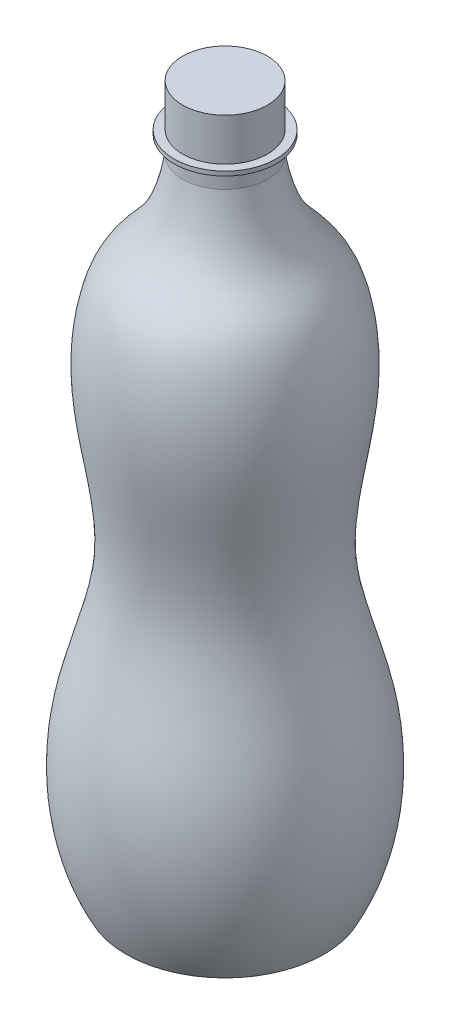
ISO-10303-21;
HEADER;
FILE_DESCRIPTION(('STEP AP214'),'2;1');
FILE_NAME('part.step','',(''),(''),'','','');
FILE_SCHEMA(('AUTOMOTIVE_DESIGN { 1 0 10303 214 1 1 1 1 }'));
ENDSEC;
DATA;
#1=APPLICATION_CONTEXT('core data for automotive mechanical design processes');
#2=APPLICATION_PROTOCOL_DEFINITION('international standard','automotive_design',2000,#1);
#3=PRODUCT_CONTEXT('',#1,'mechanical');
#4=PRODUCT('Part','Part','',(#3));
#5=PRODUCT_RELATED_PRODUCT_CATEGORY('part','',(#4));
#6=PRODUCT_DEFINITION_FORMATION('','',#4);
#7=PRODUCT_DEFINITION_CONTEXT('part definition',#1,'design');
#8=PRODUCT_DEFINITION('design','',#6,#7);
#9=PRODUCT_DEFINITION_SHAPE('','',#8);
#10=(LENGTH_UNIT() NAMED_UNIT(*) SI_UNIT(.MILLI.,.METRE.));
#11=(NAMED_UNIT(*) PLANE_ANGLE_UNIT() SI_UNIT($,.RADIAN.));
#12=(NAMED_UNIT(*) SI_UNIT($,.STERADIAN.) SOLID_ANGLE_UNIT());
#13=UNCERTAINTY_MEASURE_WITH_UNIT(LENGTH_MEASURE(1.E-05),#10,'distance_accuracy_value','');
#14=(GEOMETRIC_REPRESENTATION_CONTEXT(3) GLOBAL_UNCERTAINTY_ASSIGNED_CONTEXT((#13)) GLOBAL_UNIT_ASSIGNED_CONTEXT((#10,
#11,#12)) REPRESENTATION_CONTEXT('',''));
#15=CARTESIAN_POINT('',(0.,0.,0.));
#16=DIRECTION('',(0.,0.,1.));
#17=DIRECTION('',(1.,0.,0.));
#18=AXIS2_PLACEMENT_3D('',#15,#16,#17);
#19=CARTESIAN_POINT('',(0.,250.,0.));
#20=DIRECTION('',(0.,-1.,0.));
#21=DIRECTION('',(0.,0.,-1.));
#22=AXIS2_PLACEMENT_3D('',#19,#20,#21);
#23=PLANE('',#22);
#24=CARTESIAN_POINT('',(0.,250.,0.));
#25=DIRECTION('',(0.,-1.,0.));
#26=DIRECTION('',(0.,0.,-1.));
#27=AXIS2_PLACEMENT_3D('',#24,#25,#26);
#28=CIRCLE('',#27,15.);
#29=CARTESIAN_POINT('',(0.,250.,-15.));
#30=VERTEX_POINT('',#29);
#31=EDGE_CURVE('E10',#30,#30,#28,.T.);
#32=ORIENTED_EDGE('',*,*,#31,.F.);
#33=EDGE_LOOP('',(#32));
#34=FACE_BOUND('',#33,.T.);
#35=ADVANCED_FACE('F31',(#34),#23,.F.);
#36=CARTESIAN_POINT('',(0.,0.,0.));
#37=DIRECTION('',(0.,-1.,0.));
#38=DIRECTION('',(0.,0.,-1.));
#39=AXIS2_PLACEMENT_3D('',#36,#37,#38);
#40=CYLINDRICAL_SURFACE('',#39,15.);
#41=CARTESIAN_POINT('',(0.,235.,0.));
#42=DIRECTION('',(0.,-1.,0.));
#43=DIRECTION('',(0.,0.,-1.));
#44=AXIS2_PLACEMENT_3D('',#41,#42,#43);
#45=CIRCLE('',#44,15.);
#46=CARTESIAN_POINT('',(0.,235.,-15.));
#47=VERTEX_POINT('',#46);
#48=EDGE_CURVE('E37',#47,#47,#45,.T.);
#49=ORIENTED_EDGE('',*,*,#48,.F.);
#50=EDGE_LOOP('',(#49));
#51=FACE_BOUND('',#50,.T.);
#52=ORIENTED_EDGE('',*,*,#31,.T.);
#53=EDGE_LOOP('',(#52));
#54=FACE_BOUND('',#53,.T.);
#55=ADVANCED_FACE('F86',(#51,#54),#40,.T.);
#56=CARTESIAN_POINT('',(-15.,235.,0.));
#57=DIRECTION('',(0.,-1.,0.));
#58=DIRECTION('',(0.,0.,-1.));
#59=AXIS2_PLACEMENT_3D('',#56,#57,#58);
#60=PLANE('',#59);
#61=CARTESIAN_POINT('',(0.,235.,0.));
#62=DIRECTION('',(0.,-1.,0.));
#63=DIRECTION('',(0.,0.,-1.));
#64=AXIS2_PLACEMENT_3D('',#61,#62,#63);
#65=CIRCLE('',#64,18.);
#66=CARTESIAN_POINT('',(0.,235.,-18.));
#67=VERTEX_POINT('',#66);
#68=EDGE_CURVE('E41',#67,#67,#65,.T.);
#69=ORIENTED_EDGE('',*,*,#68,.F.);
#70=EDGE_LOOP('',(#69));
#71=FACE_BOUND('',#70,.T.);
#72=ORIENTED_EDGE('',*,*,#48,.T.);
#73=EDGE_LOOP('',(#72));
#74=FACE_BOUND('',#73,.T.);
#75=ADVANCED_FACE('F83',(#71,#74),#60,.F.);
#76=CARTESIAN_POINT('',(0.,0.,0.));
#77=DIRECTION('',(0.,-1.,0.));
#78=DIRECTION('',(0.,0.,-1.));
#79=AXIS2_PLACEMENT_3D('',#76,#77,#78);
#80=CYLINDRICAL_SURFACE('',#79,18.);
#81=CARTESIAN_POINT('',(0.,233.5,0.));
#82=DIRECTION('',(0.,-1.,0.));
#83=DIRECTION('',(0.,0.,-1.));
#84=AXIS2_PLACEMENT_3D('',#81,#82,#83);
#85=CIRCLE('',#84,18.);
#86=CARTESIAN_POINT('',(0.,233.5,-18.));
#87=VERTEX_POINT('',#86);
#88=EDGE_CURVE('E45',#87,#87,#85,.T.);
#89=ORIENTED_EDGE('',*,*,#88,.F.);
#90=EDGE_LOOP('',(#89));
#91=FACE_BOUND('',#90,.T.);
#92=ORIENTED_EDGE('',*,*,#68,.T.);
#93=EDGE_LOOP('',(#92));
#94=FACE_BOUND('',#93,.T.);
#95=ADVANCED_FACE('F79',(#91,#94),#80,.T.);
#96=CARTESIAN_POINT('',(-18.,233.5,0.));
#97=DIRECTION('',(0.,1.,0.));
#98=DIRECTION('',(0.,0.,1.));
#99=AXIS2_PLACEMENT_3D('',#96,#97,#98);
#100=PLANE('',#99);
#101=CARTESIAN_POINT('',(0.,233.5,0.));
#102=DIRECTION('',(0.,-1.,0.));
#103=DIRECTION('',(0.,0.,-1.));
#104=AXIS2_PLACEMENT_3D('',#101,#102,#103);
#105=CIRCLE('',#104,15.);
#106=CARTESIAN_POINT('',(0.,233.5,-15.));
#107=VERTEX_POINT('',#106);
#108=EDGE_CURVE('E50',#107,#107,#105,.T.);
#109=ORIENTED_EDGE('',*,*,#108,.F.);
#110=EDGE_LOOP('',(#109));
#111=FACE_BOUND('',#110,.T.);
#112=ORIENTED_EDGE('',*,*,#88,.T.);
#113=EDGE_LOOP('',(#112));
#114=FACE_BOUND('',#113,.T.);
#115=ADVANCED_FACE('F75',(#111,#114),#100,.F.);
#116=CARTESIAN_POINT('',(0.,0.,0.));
#117=DIRECTION('',(0.,-1.,0.));
#118=DIRECTION('',(0.,0.,-1.));
#119=AXIS2_PLACEMENT_3D('',#116,#117,#118);
#120=CYLINDRICAL_SURFACE('',#119,15.);
#121=CARTESIAN_POINT('',(0.,227.283149651613,0.));
#122=DIRECTION('',(0.,-1.,0.));
#123=DIRECTION('',(0.,0.,-1.));
#124=AXIS2_PLACEMENT_3D('',#121,#122,#123);
#125=CIRCLE('',#124,15.);
#126=CARTESIAN_POINT('',(0.,227.283149651613,-15.));
#127=VERTEX_POINT('',#126);
#128=EDGE_CURVE('E53',#127,#127,#125,.T.);
#129=ORIENTED_EDGE('',*,*,#128,.F.);
#130=EDGE_LOOP('',(#129));
#131=FACE_BOUND('',#130,.T.);
#132=ORIENTED_EDGE('',*,*,#108,.T.);
#133=EDGE_LOOP('',(#132));
#134=FACE_BOUND('',#133,.T.);
#135=ADVANCED_FACE('F71',(#131,#134),#120,.T.);
#136=CARTESIAN_POINT('',(-15.,227.283149651613,0.));
#137=CARTESIAN_POINT('',(-16.2779867145717,219.305420884975,0.));
#138=CARTESIAN_POINT('',(-19.4893443259324,206.260916928536,0.));
#139=CARTESIAN_POINT('',(-32.6843485645564,194.323220300507,0.));
#140=CARTESIAN_POINT('',(-38.5472756217203,176.702280823638,0.));
#141=CARTESIAN_POINT('',(-39.1626622543908,152.864617410153,0.));
#142=CARTESIAN_POINT('',(-33.5615714762271,127.462649854381,0.));
#143=CARTESIAN_POINT('',(-30.9907214927205,94.9779500462343,0.));
#144=CARTESIAN_POINT('',(-48.2416646374808,54.8633675852008,0.));
#145=CARTESIAN_POINT('',(-44.5570071933631,17.9896633469699,0.));
#146=CARTESIAN_POINT('',(-35.,0.,0.));
#147=B_SPLINE_CURVE_WITH_KNOTS('',3,(#136,#137,#138,#139,#140,#141,#142,#143,#144,#145,#146),
.UNSPECIFIED.,.F.,.F.,(4,1,1,1,1,1,1,1,4),(0.,0.105527686602757,0.159807734462715,
0.221005565074455,0.33501010215689,0.459707985269627,0.55219215435714,0.743984646680737,1.),.UNSPECIFIED.);
#148=CARTESIAN_POINT('',(0.,0.,0.));
#149=DIRECTION('',(0.,-1.,0.));
#150=AXIS1_PLACEMENT('',#148,#149);
#151=SURFACE_OF_REVOLUTION('',#147,#150);
#152=CARTESIAN_POINT('',(0.,0.,0.));
#153=DIRECTION('',(0.,-1.,0.));
#154=DIRECTION('',(0.,0.,-1.));
#155=AXIS2_PLACEMENT_3D('',#152,#153,#154);
#156=CIRCLE('',#155,35.);
#157=CARTESIAN_POINT('',(0.,0.,-35.));
#158=VERTEX_POINT('',#157);
#159=EDGE_CURVE('E56',#158,#158,#156,.T.);
#160=ORIENTED_EDGE('',*,*,#159,.F.);
#161=EDGE_LOOP('',(#160));
#162=FACE_BOUND('',#161,.T.);
#163=ORIENTED_EDGE('',*,*,#128,.T.);
#164=EDGE_LOOP('',(#163));
#165=FACE_BOUND('',#164,.T.);
#166=ADVANCED_FACE('F66',(#162,#165),#151,.T.);
#167=CARTESIAN_POINT('',(-35.,0.,0.));
#168=DIRECTION('',(0.,1.,0.));
#169=DIRECTION('',(0.,0.,1.));
#170=AXIS2_PLACEMENT_3D('',#167,#168,#169);
#171=PLANE('',#170);
#172=ORIENTED_EDGE('',*,*,#159,.T.);
#173=EDGE_LOOP('',(#172));
#174=FACE_BOUND('',#173,.T.);
#175=ADVANCED_FACE('F70',(#174),#171,.F.);
#176=CLOSED_SHELL('',(#35,#55,#75,#95,#115,#135,#166,#175));
#177=MANIFOLD_SOLID_BREP('B2',#176);
#178=ADVANCED_BREP_SHAPE_REPRESENTATION('',(#18,#177),#14);
#179=SHAPE_DEFINITION_REPRESENTATION(#9,#178);
ENDSEC;
END-ISO-10303-21;
